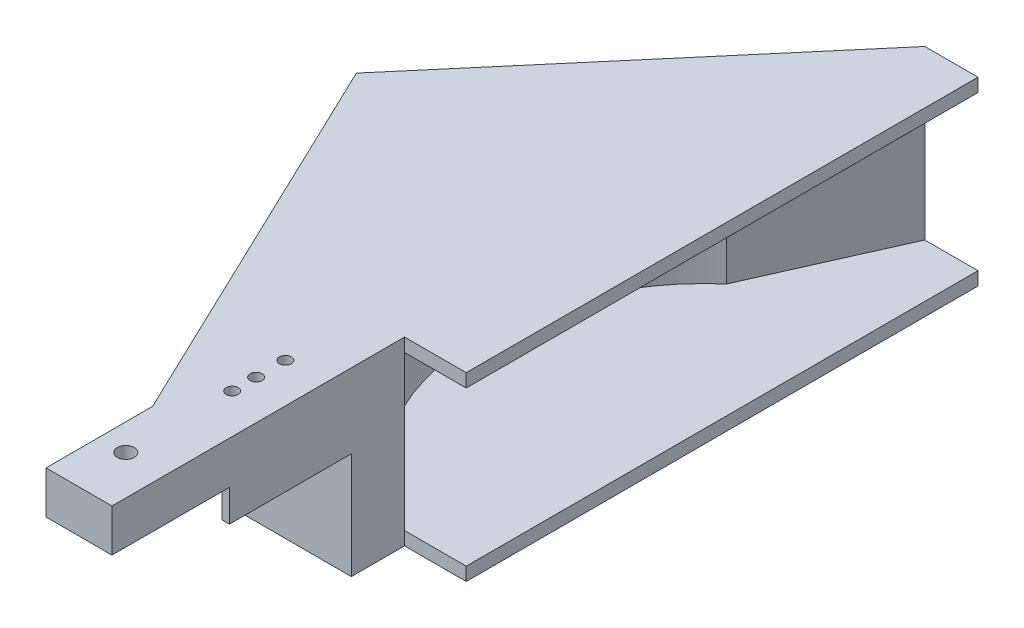
ISO-10303-21;
HEADER;
FILE_DESCRIPTION(('STEP AP214'),'2;1');
FILE_NAME('part.step','',(''),(''),'','','');
FILE_SCHEMA(('AUTOMOTIVE_DESIGN { 1 0 10303 214 1 1 1 1 }'));
ENDSEC;
DATA;
#1=APPLICATION_CONTEXT('core data for automotive mechanical design processes');
#2=APPLICATION_PROTOCOL_DEFINITION('international standard','automotive_design',2000,#1);
#3=PRODUCT_CONTEXT('',#1,'mechanical');
#4=PRODUCT('Part','Part','',(#3));
#5=PRODUCT_RELATED_PRODUCT_CATEGORY('part','',(#4));
#6=PRODUCT_DEFINITION_FORMATION('','',#4);
#7=PRODUCT_DEFINITION_CONTEXT('part definition',#1,'design');
#8=PRODUCT_DEFINITION('design','',#6,#7);
#9=PRODUCT_DEFINITION_SHAPE('','',#8);
#10=(LENGTH_UNIT() NAMED_UNIT(*) SI_UNIT(.MILLI.,.METRE.));
#11=(NAMED_UNIT(*) PLANE_ANGLE_UNIT() SI_UNIT($,.RADIAN.));
#12=(NAMED_UNIT(*) SI_UNIT($,.STERADIAN.) SOLID_ANGLE_UNIT());
#13=UNCERTAINTY_MEASURE_WITH_UNIT(LENGTH_MEASURE(1.E-05),#10,'distance_accuracy_value','');
#14=(GEOMETRIC_REPRESENTATION_CONTEXT(3) GLOBAL_UNCERTAINTY_ASSIGNED_CONTEXT((#13)) GLOBAL_UNIT_ASSIGNED_CONTEXT((#10,
#11,#12)) REPRESENTATION_CONTEXT('',''));
#15=CARTESIAN_POINT('',(0.,0.,0.));
#16=DIRECTION('',(0.,0.,1.));
#17=DIRECTION('',(1.,0.,0.));
#18=AXIS2_PLACEMENT_3D('',#15,#16,#17);
#19=CARTESIAN_POINT('',(65.6220237420334,14.,0.));
#20=DIRECTION('',(0.,-1.,0.));
#21=DIRECTION('',(0.,0.,-1.));
#22=AXIS2_PLACEMENT_3D('',#19,#20,#21);
#23=CYLINDRICAL_SURFACE('',#22,42.5);
#24=CARTESIAN_POINT('',(65.6220237420334,-17.5,0.));
#25=DIRECTION('',(0.,-1.,0.));
#26=DIRECTION('',(0.,0.,-1.));
#27=AXIS2_PLACEMENT_3D('',#24,#25,#26);
#28=CIRCLE('',#27,42.5);
#29=CARTESIAN_POINT('',(37.6279708810943,-17.5,-31.977851779301));
#30=VERTEX_POINT('',#29);
#31=CARTESIAN_POINT('',(47.5,-17.5,38.4427139454693));
#32=VERTEX_POINT('',#31);
#33=EDGE_CURVE('E207',#30,#32,#28,.F.);
#34=ORIENTED_EDGE('',*,*,#33,.F.);
#35=DIRECTION('',(0.,-1.,0.));
#36=VECTOR('',#35,1.);
#37=CARTESIAN_POINT('',(37.6279708810943,14.,-31.977851779301));
#38=LINE('',#37,#36);
#39=CARTESIAN_POINT('',(37.6279708810943,11.5,-31.977851779301));
#40=VERTEX_POINT('',#39);
#41=EDGE_CURVE('E368',#40,#30,#38,.T.);
#42=ORIENTED_EDGE('',*,*,#41,.F.);
#43=CARTESIAN_POINT('',(65.6220237420334,11.5,0.));
#44=DIRECTION('',(0.,1.,0.));
#45=DIRECTION('',(0.,0.,1.));
#46=AXIS2_PLACEMENT_3D('',#43,#44,#45);
#47=CIRCLE('',#46,42.5);
#48=CARTESIAN_POINT('',(47.5,11.5,38.4427139454693));
#49=VERTEX_POINT('',#48);
#50=EDGE_CURVE('E249',#49,#40,#47,.F.);
#51=ORIENTED_EDGE('',*,*,#50,.F.);
#52=DIRECTION('',(0.,-1.,0.));
#53=VECTOR('',#52,1.);
#54=CARTESIAN_POINT('',(47.5,14.,38.4427139454693));
#55=LINE('',#54,#53);
#56=EDGE_CURVE('E371',#49,#32,#55,.T.);
#57=ORIENTED_EDGE('',*,*,#56,.T.);
#58=EDGE_LOOP('',(#34,#42,#51,#57));
#59=FACE_BOUND('',#58,.T.);
#60=ADVANCED_FACE('F43',(#59),#23,.F.);
#61=CARTESIAN_POINT('',(49.0919336266223,14.,-57.7552160313204));
#62=DIRECTION('',(-0.913714746404058,0.,-0.406356201138567));
#63=DIRECTION('',(-0.406356201138567,0.,0.913714746404058));
#64=AXIS2_PLACEMENT_3D('',#61,#62,#63);
#65=PLANE('',#64);
#66=DIRECTION('',(-0.406356201138567,0.,0.913714746404058));
#67=VECTOR('',#66,1.);
#68=CARTESIAN_POINT('',(49.0919336266223,-17.5,-57.7552160313204));
#69=LINE('',#68,#67);
#70=CARTESIAN_POINT('',(49.0919336266223,-17.5,-57.7552160313204));
#71=VERTEX_POINT('',#70);
#72=EDGE_CURVE('E225',#71,#30,#69,.T.);
#73=ORIENTED_EDGE('',*,*,#72,.F.);
#74=DIRECTION('',(0.,-1.,0.));
#75=VECTOR('',#74,1.);
#76=CARTESIAN_POINT('',(49.0919336266223,14.,-57.7552160313204));
#77=LINE('',#76,#75);
#78=CARTESIAN_POINT('',(49.0919336266223,11.5,-57.7552160313204));
#79=VERTEX_POINT('',#78);
#80=EDGE_CURVE('E364',#79,#71,#77,.T.);
#81=ORIENTED_EDGE('',*,*,#80,.F.);
#82=DIRECTION('',(0.406356201138567,0.,-0.913714746404058));
#83=VECTOR('',#82,1.);
#84=CARTESIAN_POINT('',(49.0919336266223,11.5,-57.7552160313204));
#85=LINE('',#84,#83);
#86=EDGE_CURVE('E246',#40,#79,#85,.T.);
#87=ORIENTED_EDGE('',*,*,#86,.F.);
#88=ORIENTED_EDGE('',*,*,#41,.T.);
#89=EDGE_LOOP('',(#73,#81,#87,#88));
#90=FACE_BOUND('',#89,.T.);
#91=ADVANCED_FACE('F445',(#90),#65,.F.);
#92=CARTESIAN_POINT('',(65.6220237420334,0.,0.));
#93=DIRECTION('',(0.,1.,0.));
#94=DIRECTION('',(0.,0.,1.));
#95=AXIS2_PLACEMENT_3D('',#92,#93,#94);
#96=PLANE('',#95);
#97=DIRECTION('',(-1.,0.,0.));
#98=VECTOR('',#97,1.);
#99=CARTESIAN_POINT('',(47.5,0.,48.4427139454693));
#100=LINE('',#99,#98);
#101=CARTESIAN_POINT('',(47.5,0.,48.4427139454692));
#102=VERTEX_POINT('',#101);
#103=CARTESIAN_POINT('',(23.1583238465963,0.,48.4427139454692));
#104=VERTEX_POINT('',#103);
#105=EDGE_CURVE('E66',#102,#104,#100,.T.);
#106=ORIENTED_EDGE('',*,*,#105,.F.);
#107=DIRECTION('',(0.,0.,-1.));
#108=VECTOR('',#107,1.);
#109=CARTESIAN_POINT('',(47.5,0.,78.4427139454693));
#110=LINE('',#109,#108);
#111=CARTESIAN_POINT('',(47.5,0.,71.3827051827319));
#112=VERTEX_POINT('',#111);
#113=EDGE_CURVE('E338',#112,#102,#110,.T.);
#114=ORIENTED_EDGE('',*,*,#113,.F.);
#115=DIRECTION('',(-1.,0.,0.));
#116=VECTOR('',#115,1.);
#117=CARTESIAN_POINT('',(32.1709783052936,0.,71.3827051827319));
#118=LINE('',#117,#116);
#119=CARTESIAN_POINT('',(46.1350961199202,0.,71.3827051827319));
#120=VERTEX_POINT('',#119);
#121=EDGE_CURVE('E274',#112,#120,#118,.T.);
#122=ORIENTED_EDGE('',*,*,#121,.T.);
#123=DIRECTION('',(0.,0.,1.));
#124=VECTOR('',#123,1.);
#125=CARTESIAN_POINT('',(46.1350961199202,0.,88.0289774574965));
#126=LINE('',#125,#124);
#127=CARTESIAN_POINT('',(46.1350961199202,0.,70.0289774574952));
#128=VERTEX_POINT('',#127);
#129=EDGE_CURVE('E310',#128,#120,#126,.T.);
#130=ORIENTED_EDGE('',*,*,#129,.F.);
#131=DIRECTION('',(0.0772248727797807,0.,0.997013700519781));
#132=VECTOR('',#131,1.);
#133=CARTESIAN_POINT('',(46.1350961199202,0.,70.0289774574952));
#134=LINE('',#133,#132);
#135=CARTESIAN_POINT('',(44.8209111973895,0.,53.0621593117926));
#136=VERTEX_POINT('',#135);
#137=EDGE_CURVE('E320',#136,#128,#134,.T.);
#138=ORIENTED_EDGE('',*,*,#137,.F.);
#139=CARTESIAN_POINT('',(40.0850961199206,0.,53.4289774574965));
#140=DIRECTION('',(0.,-1.,0.));
#141=DIRECTION('',(0.,0.,1.));
#142=AXIS2_PLACEMENT_3D('',#139,#140,#141);
#143=CIRCLE('',#142,4.75);
#144=CARTESIAN_POINT('',(35.3456634300069,0.,53.1123107908298));
#145=VERTEX_POINT('',#144);
#146=EDGE_CURVE('E305',#145,#136,#143,.T.);
#147=ORIENTED_EDGE('',*,*,#146,.F.);
#148=DIRECTION('',(-0.0666666666666827,0.,0.997775303139717));
#149=VECTOR('',#148,1.);
#150=CARTESIAN_POINT('',(39.013168498046,0.,-1.77787892459443));
#151=LINE('',#150,#149);
#152=CARTESIAN_POINT('',(34.1249213561542,0.,71.3827051827318));
#153=VERTEX_POINT('',#152);
#154=EDGE_CURVE('E374',#145,#153,#151,.T.);
#155=ORIENTED_EDGE('',*,*,#154,.T.);
#156=DIRECTION('',(0.431304970230721,0.,0.902206197415135));
#157=VECTOR('',#156,1.);
#158=CARTESIAN_POINT('',(0.,0.,0.));
#159=LINE('',#158,#157);
#160=EDGE_CURVE('E343',#104,#153,#159,.T.);
#161=ORIENTED_EDGE('',*,*,#160,.F.);
#162=EDGE_LOOP('',(#106,#114,#122,#130,#138,#147,#155,#161));
#163=FACE_BOUND('',#162,.T.);
#164=ADVANCED_FACE('F420',(#163),#96,.F.);
#165=CARTESIAN_POINT('',(46.1350961199202,6.,88.0289774574965));
#166=DIRECTION('',(1.,0.,0.));
#167=DIRECTION('',(0.,0.,-1.));
#168=AXIS2_PLACEMENT_3D('',#165,#166,#167);
#169=PLANE('',#168);
#170=DIRECTION('',(0.,-1.,0.));
#171=VECTOR('',#170,1.);
#172=CARTESIAN_POINT('',(46.1350961199202,6.,71.3827051827319));
#173=LINE('',#172,#171);
#174=CARTESIAN_POINT('',(46.1350961199202,6.,71.3827051827319));
#175=VERTEX_POINT('',#174);
#176=EDGE_CURVE('E11',#175,#120,#173,.T.);
#177=ORIENTED_EDGE('',*,*,#176,.F.);
#178=DIRECTION('',(0.,0.,1.));
#179=VECTOR('',#178,1.);
#180=CARTESIAN_POINT('',(46.1350961199202,6.,88.0289774574965));
#181=LINE('',#180,#179);
#182=CARTESIAN_POINT('',(46.1350961199202,6.,70.0289774574952));
#183=VERTEX_POINT('',#182);
#184=EDGE_CURVE('E313',#183,#175,#181,.T.);
#185=ORIENTED_EDGE('',*,*,#184,.F.);
#186=DIRECTION('',(0.,-1.,0.));
#187=VECTOR('',#186,1.);
#188=CARTESIAN_POINT('',(46.1350961199202,6.,70.0289774574952));
#189=LINE('',#188,#187);
#190=EDGE_CURVE('E329',#183,#128,#189,.T.);
#191=ORIENTED_EDGE('',*,*,#190,.T.);
#192=ORIENTED_EDGE('',*,*,#129,.T.);
#193=EDGE_LOOP('',(#177,#185,#191,#192));
#194=FACE_BOUND('',#193,.T.);
#195=ADVANCED_FACE('F416',(#194),#169,.F.);
#196=CARTESIAN_POINT('',(47.5,14.,78.4427139454693));
#197=DIRECTION('',(-1.,0.,0.));
#198=DIRECTION('',(0.,0.,1.));
#199=AXIS2_PLACEMENT_3D('',#196,#197,#198);
#200=PLANE('',#199);
#201=DIRECTION('',(0.,-1.,0.));
#202=VECTOR('',#201,1.);
#203=CARTESIAN_POINT('',(47.5,14.,93.4427139454693));
#204=LINE('',#203,#202);
#205=CARTESIAN_POINT('',(47.5,14.,93.4427139454693));
#206=VERTEX_POINT('',#205);
#207=CARTESIAN_POINT('',(47.5,6.,93.4427139454693));
#208=VERTEX_POINT('',#207);
#209=EDGE_CURVE('E351',#206,#208,#204,.T.);
#210=ORIENTED_EDGE('',*,*,#209,.T.);
#211=DIRECTION('',(0.,0.,-1.));
#212=VECTOR('',#211,1.);
#213=CARTESIAN_POINT('',(47.5,6.,78.4427139454693));
#214=LINE('',#213,#212);
#215=CARTESIAN_POINT('',(47.5,6.,71.3827051827319));
#216=VERTEX_POINT('',#215);
#217=EDGE_CURVE('E282',#208,#216,#214,.T.);
#218=ORIENTED_EDGE('',*,*,#217,.T.);
#219=DIRECTION('',(0.,1.,0.));
#220=VECTOR('',#219,1.);
#221=CARTESIAN_POINT('',(47.5,14.,71.3827051827319));
#222=LINE('',#221,#220);
#223=EDGE_CURVE('E285',#112,#216,#222,.T.);
#224=ORIENTED_EDGE('',*,*,#223,.F.);
#225=ORIENTED_EDGE('',*,*,#113,.T.);
#226=DIRECTION('',(0.,1.,0.));
#227=VECTOR('',#226,1.);
#228=CARTESIAN_POINT('',(47.5,-20.,48.4427139454693));
#229=LINE('',#228,#227);
#230=CARTESIAN_POINT('',(47.5,-20.,48.4427139454693));
#231=VERTEX_POINT('',#230);
#232=EDGE_CURVE('E264',#231,#102,#229,.T.);
#233=ORIENTED_EDGE('',*,*,#232,.F.);
#234=DIRECTION('',(0.,0.,1.));
#235=VECTOR('',#234,1.);
#236=CARTESIAN_POINT('',(47.5,-20.,38.4427139454693));
#237=LINE('',#236,#235);
#238=CARTESIAN_POINT('',(47.5,-20.,38.4427139454693));
#239=VERTEX_POINT('',#238);
#240=EDGE_CURVE('E251',#239,#231,#237,.T.);
#241=ORIENTED_EDGE('',*,*,#240,.F.);
#242=DIRECTION('',(0.,1.,0.));
#243=VECTOR('',#242,1.);
#244=CARTESIAN_POINT('',(47.5,14.,38.4427139454693));
#245=LINE('',#244,#243);
#246=EDGE_CURVE('E221',#239,#32,#245,.T.);
#247=ORIENTED_EDGE('',*,*,#246,.T.);
#248=ORIENTED_EDGE('',*,*,#56,.F.);
#249=CARTESIAN_POINT('',(47.5,14.,38.4427139454693));
#250=VERTEX_POINT('',#249);
#251=EDGE_CURVE('E372',#250,#49,#55,.T.);
#252=ORIENTED_EDGE('',*,*,#251,.F.);
#253=DIRECTION('',(0.,0.,-1.));
#254=VECTOR('',#253,1.);
#255=CARTESIAN_POINT('',(47.5,14.,78.4427139454693));
#256=LINE('',#255,#254);
#257=EDGE_CURVE('E339',#206,#250,#256,.T.);
#258=ORIENTED_EDGE('',*,*,#257,.F.);
#259=EDGE_LOOP('',(#210,#218,#224,#225,#233,#241,#247,#248,#252,#258));
#260=FACE_BOUND('',#259,.T.);
#261=ADVANCED_FACE('F45',(#260),#200,.F.);
#262=CARTESIAN_POINT('',(49.0919336266223,14.,-57.7552160313204));
#263=DIRECTION('',(0.761939317759459,0.,0.64764842009554));
#264=DIRECTION('',(0.64764842009554,0.,-0.761939317759459));
#265=AXIS2_PLACEMENT_3D('',#262,#263,#264);
#266=PLANE('',#265);
#267=DIRECTION('',(0.,-1.,0.));
#268=VECTOR('',#267,1.);
#269=CARTESIAN_POINT('',(49.0919336266223,-17.5,-57.7552160313204));
#270=LINE('',#269,#268);
#271=CARTESIAN_POINT('',(49.0919336266223,-20.,-57.7552160313204));
#272=VERTEX_POINT('',#271);
#273=EDGE_CURVE('E197',#71,#272,#270,.T.);
#274=ORIENTED_EDGE('',*,*,#273,.T.);
#275=DIRECTION('',(0.64764842009554,0.,-0.761939317759459));
#276=VECTOR('',#275,1.);
#277=CARTESIAN_POINT('',(49.0919336266223,-20.,-57.7552160313204));
#278=LINE('',#277,#276);
#279=CARTESIAN_POINT('',(0.,-20.,0.));
#280=VERTEX_POINT('',#279);
#281=EDGE_CURVE('E258',#280,#272,#278,.T.);
#282=ORIENTED_EDGE('',*,*,#281,.F.);
#283=DIRECTION('',(0.,-1.,0.));
#284=VECTOR('',#283,1.);
#285=CARTESIAN_POINT('',(0.,14.,0.));
#286=LINE('',#285,#284);
#287=CARTESIAN_POINT('',(0.,14.,0.));
#288=VERTEX_POINT('',#287);
#289=EDGE_CURVE('E362',#288,#280,#286,.T.);
#290=ORIENTED_EDGE('',*,*,#289,.F.);
#291=DIRECTION('',(-0.64764842009554,0.,0.761939317759459));
#292=VECTOR('',#291,1.);
#293=CARTESIAN_POINT('',(49.0919336266223,14.,-57.7552160313204));
#294=LINE('',#293,#292);
#295=CARTESIAN_POINT('',(49.0919336266223,14.,-57.7552160313204));
#296=VERTEX_POINT('',#295);
#297=EDGE_CURVE('E342',#296,#288,#294,.T.);
#298=ORIENTED_EDGE('',*,*,#297,.F.);
#299=EDGE_CURVE('E365',#296,#79,#77,.T.);
#300=ORIENTED_EDGE('',*,*,#299,.T.);
#301=ORIENTED_EDGE('',*,*,#80,.T.);
#302=EDGE_LOOP('',(#274,#282,#290,#298,#300,#301));
#303=FACE_BOUND('',#302,.T.);
#304=ADVANCED_FACE('F448',(#303),#266,.F.);
#305=CARTESIAN_POINT('',(0.,14.,0.));
#306=DIRECTION('',(0.902206197415135,0.,-0.431304970230721));
#307=DIRECTION('',(-0.431304970230721,0.,-0.902206197415135));
#308=AXIS2_PLACEMENT_3D('',#305,#306,#307);
#309=PLANE('',#308);
#310=ORIENTED_EDGE('',*,*,#289,.T.);
#311=DIRECTION('',(-0.43130497023072,0.,-0.902206197415135));
#312=VECTOR('',#311,1.);
#313=CARTESIAN_POINT('',(23.1583238465963,-20.,48.4427139454692));
#314=LINE('',#313,#312);
#315=CARTESIAN_POINT('',(23.1583238465963,-20.,48.4427139454692));
#316=VERTEX_POINT('',#315);
#317=EDGE_CURVE('E255',#316,#280,#314,.T.);
#318=ORIENTED_EDGE('',*,*,#317,.F.);
#319=DIRECTION('',(0.,1.,0.));
#320=VECTOR('',#319,1.);
#321=CARTESIAN_POINT('',(23.1583238465963,-20.,48.4427139454692));
#322=LINE('',#321,#320);
#323=EDGE_CURVE('E260',#316,#104,#322,.T.);
#324=ORIENTED_EDGE('',*,*,#323,.T.);
#325=ORIENTED_EDGE('',*,*,#160,.T.);
#326=DIRECTION('',(0.,1.,0.));
#327=VECTOR('',#326,1.);
#328=CARTESIAN_POINT('',(34.1249213561542,14.,71.3827051827318));
#329=LINE('',#328,#327);
#330=CARTESIAN_POINT('',(34.1249213561543,6.,71.3827051827319));
#331=VERTEX_POINT('',#330);
#332=EDGE_CURVE('E328',#153,#331,#329,.T.);
#333=ORIENTED_EDGE('',*,*,#332,.T.);
#334=DIRECTION('',(0.431304970230721,0.,0.902206197415135));
#335=VECTOR('',#334,1.);
#336=CARTESIAN_POINT('',(0.,6.,0.));
#337=LINE('',#336,#335);
#338=CARTESIAN_POINT('',(35.1,6.,73.4223802529592));
#339=VERTEX_POINT('',#338);
#340=EDGE_CURVE('E335',#331,#339,#337,.T.);
#341=ORIENTED_EDGE('',*,*,#340,.T.);
#342=DIRECTION('',(0.,-1.,0.));
#343=VECTOR('',#342,1.);
#344=CARTESIAN_POINT('',(35.1,14.,73.4223802529592));
#345=LINE('',#344,#343);
#346=CARTESIAN_POINT('',(35.1,14.,73.4223802529592));
#347=VERTEX_POINT('',#346);
#348=EDGE_CURVE('E359',#347,#339,#345,.T.);
#349=ORIENTED_EDGE('',*,*,#348,.F.);
#350=DIRECTION('',(0.431304970230721,0.,0.902206197415135));
#351=VECTOR('',#350,1.);
#352=CARTESIAN_POINT('',(0.,14.,0.));
#353=LINE('',#352,#351);
#354=EDGE_CURVE('E345',#288,#347,#353,.T.);
#355=ORIENTED_EDGE('',*,*,#354,.F.);
#356=EDGE_LOOP('',(#310,#318,#324,#325,#333,#341,#349,#355));
#357=FACE_BOUND('',#356,.T.);
#358=ADVANCED_FACE('F398',(#357),#309,.F.);
#359=CARTESIAN_POINT('',(35.1,14.,73.4223802529592));
#360=DIRECTION('',(1.,0.,0.));
#361=DIRECTION('',(0.,0.,-1.));
#362=AXIS2_PLACEMENT_3D('',#359,#360,#361);
#363=PLANE('',#362);
#364=DIRECTION('',(0.,0.,1.));
#365=VECTOR('',#364,1.);
#366=CARTESIAN_POINT('',(35.1,6.,73.4223802529592));
#367=LINE('',#366,#365);
#368=CARTESIAN_POINT('',(35.1,6.,93.4427139454693));
#369=VERTEX_POINT('',#368);
#370=EDGE_CURVE('E51',#339,#369,#367,.T.);
#371=ORIENTED_EDGE('',*,*,#370,.T.);
#372=DIRECTION('',(0.,-1.,0.));
#373=VECTOR('',#372,1.);
#374=CARTESIAN_POINT('',(35.1,14.,93.4427139454693));
#375=LINE('',#374,#373);
#376=CARTESIAN_POINT('',(35.1,14.,93.4427139454693));
#377=VERTEX_POINT('',#376);
#378=EDGE_CURVE('E356',#377,#369,#375,.T.);
#379=ORIENTED_EDGE('',*,*,#378,.F.);
#380=DIRECTION('',(0.,0.,1.));
#381=VECTOR('',#380,1.);
#382=CARTESIAN_POINT('',(35.1,14.,73.4223802529592));
#383=LINE('',#382,#381);
#384=EDGE_CURVE('E347',#347,#377,#383,.T.);
#385=ORIENTED_EDGE('',*,*,#384,.F.);
#386=ORIENTED_EDGE('',*,*,#348,.T.);
#387=EDGE_LOOP('',(#371,#379,#385,#386));
#388=FACE_BOUND('',#387,.T.);
#389=ADVANCED_FACE('F379',(#388),#363,.F.);
#390=CARTESIAN_POINT('',(37.5,14.,93.4427139454693));
#391=DIRECTION('',(0.,0.,-1.));
#392=DIRECTION('',(-1.,0.,0.));
#393=AXIS2_PLACEMENT_3D('',#390,#391,#392);
#394=PLANE('',#393);
#395=ORIENTED_EDGE('',*,*,#378,.T.);
#396=DIRECTION('',(1.,0.,0.));
#397=VECTOR('',#396,1.);
#398=CARTESIAN_POINT('',(37.5,6.,93.4427139454693));
#399=LINE('',#398,#397);
#400=EDGE_CURVE('E277',#369,#208,#399,.T.);
#401=ORIENTED_EDGE('',*,*,#400,.T.);
#402=ORIENTED_EDGE('',*,*,#209,.F.);
#403=DIRECTION('',(1.,0.,0.));
#404=VECTOR('',#403,1.);
#405=CARTESIAN_POINT('',(35.1,14.,93.4427139454693));
#406=LINE('',#405,#404);
#407=EDGE_CURVE('E349',#377,#206,#406,.T.);
#408=ORIENTED_EDGE('',*,*,#407,.F.);
#409=EDGE_LOOP('',(#395,#401,#402,#408));
#410=FACE_BOUND('',#409,.T.);
#411=ADVANCED_FACE('F388',(#410),#394,.F.);
#412=CARTESIAN_POINT('',(65.6220237420334,14.,0.));
#413=DIRECTION('',(0.,1.,0.));
#414=DIRECTION('',(0.,0.,1.));
#415=AXIS2_PLACEMENT_3D('',#412,#413,#414);
#416=PLANE('',#415);
#417=ORIENTED_EDGE('',*,*,#257,.T.);
#418=DIRECTION('',(1.,0.,0.));
#419=VECTOR('',#418,1.);
#420=CARTESIAN_POINT('',(23.1220237420334,14.,38.4427139454693));
#421=LINE('',#420,#419);
#422=CARTESIAN_POINT('',(59.0919336266223,14.,38.4427139454693));
#423=VERTEX_POINT('',#422);
#424=EDGE_CURVE('E232',#250,#423,#421,.T.);
#425=ORIENTED_EDGE('',*,*,#424,.T.);
#426=DIRECTION('',(0.,0.,-1.));
#427=VECTOR('',#426,1.);
#428=CARTESIAN_POINT('',(59.0919336266223,14.,-57.7552160313204));
#429=LINE('',#428,#427);
#430=CARTESIAN_POINT('',(59.0919336266223,14.,-57.7552160313204));
#431=VERTEX_POINT('',#430);
#432=EDGE_CURVE('E228',#423,#431,#429,.T.);
#433=ORIENTED_EDGE('',*,*,#432,.T.);
#434=DIRECTION('',(-1.,0.,0.));
#435=VECTOR('',#434,1.);
#436=CARTESIAN_POINT('',(49.0919336266223,14.,-57.7552160313204));
#437=LINE('',#436,#435);
#438=EDGE_CURVE('E239',#431,#296,#437,.T.);
#439=ORIENTED_EDGE('',*,*,#438,.T.);
#440=ORIENTED_EDGE('',*,*,#297,.T.);
#441=ORIENTED_EDGE('',*,*,#354,.T.);
#442=ORIENTED_EDGE('',*,*,#384,.T.);
#443=ORIENTED_EDGE('',*,*,#407,.T.);
#444=EDGE_LOOP('',(#417,#425,#433,#439,#440,#441,#442,#443));
#445=FACE_BOUND('',#444,.T.);
#446=CARTESIAN_POINT('',(40.0850961199206,14.,83.4289774574965));
#447=DIRECTION('',(0.,1.,0.));
#448=DIRECTION('',(0.,0.,1.));
#449=AXIS2_PLACEMENT_3D('',#446,#447,#448);
#450=CIRCLE('',#449,1.6);
#451=CARTESIAN_POINT('',(40.0850961199206,14.,85.0289774574965));
#452=VERTEX_POINT('',#451);
#453=EDGE_CURVE('E267',#452,#452,#450,.T.);
#454=ORIENTED_EDGE('',*,*,#453,.F.);
#455=EDGE_LOOP('',(#454));
#456=FACE_BOUND('',#455,.T.);
#457=CARTESIAN_POINT('',(40.0850961199206,14.,63.4289774574965));
#458=DIRECTION('',(0.,1.,0.));
#459=DIRECTION('',(0.,0.,1.));
#460=AXIS2_PLACEMENT_3D('',#457,#458,#459);
#461=CIRCLE('',#460,1.125);
#462=CARTESIAN_POINT('',(40.0850961199206,14.,64.5539774574965));
#463=VERTEX_POINT('',#462);
#464=EDGE_CURVE('E302',#463,#463,#461,.T.);
#465=ORIENTED_EDGE('',*,*,#464,.F.);
#466=EDGE_LOOP('',(#465));
#467=FACE_BOUND('',#466,.T.);
#468=CARTESIAN_POINT('',(40.0850961199206,14.,58.9289774574965));
#469=DIRECTION('',(0.,1.,0.));
#470=DIRECTION('',(0.,0.,1.));
#471=AXIS2_PLACEMENT_3D('',#468,#469,#470);
#472=CIRCLE('',#471,1.125);
#473=CARTESIAN_POINT('',(40.0850961199206,14.,60.0539774574965));
#474=VERTEX_POINT('',#473);
#475=EDGE_CURVE('E299',#474,#474,#472,.T.);
#476=ORIENTED_EDGE('',*,*,#475,.F.);
#477=EDGE_LOOP('',(#476));
#478=FACE_BOUND('',#477,.T.);
#479=CARTESIAN_POINT('',(40.0850961199206,14.,53.4289774574965));
#480=DIRECTION('',(0.,1.,0.));
#481=DIRECTION('',(0.,0.,1.));
#482=AXIS2_PLACEMENT_3D('',#479,#480,#481);
#483=CIRCLE('',#482,1.125);
#484=CARTESIAN_POINT('',(40.0850961199206,14.,54.5539774574965));
#485=VERTEX_POINT('',#484);
#486=EDGE_CURVE('E291',#485,#485,#483,.T.);
#487=ORIENTED_EDGE('',*,*,#486,.F.);
#488=EDGE_LOOP('',(#487));
#489=FACE_BOUND('',#488,.T.);
#490=ADVANCED_FACE('F391',(#445,#456,#467,#478,#489),#416,.T.);
#491=CARTESIAN_POINT('',(40.0850961199206,6.,53.4289774574965));
#492=DIRECTION('',(0.,1.,0.));
#493=DIRECTION('',(0.,0.,1.));
#494=AXIS2_PLACEMENT_3D('',#491,#492,#493);
#495=PLANE('',#494);
#496=CARTESIAN_POINT('',(40.0850961199206,6.,83.4289774574965));
#497=DIRECTION('',(0.,1.,0.));
#498=DIRECTION('',(0.,0.,1.));
#499=AXIS2_PLACEMENT_3D('',#496,#497,#498);
#500=CIRCLE('',#499,1.6);
#501=CARTESIAN_POINT('',(40.0850961199206,6.,85.0289774574965));
#502=VERTEX_POINT('',#501);
#503=EDGE_CURVE('E270',#502,#502,#500,.F.);
#504=ORIENTED_EDGE('',*,*,#503,.F.);
#505=EDGE_LOOP('',(#504));
#506=FACE_BOUND('',#505,.T.);
#507=ORIENTED_EDGE('',*,*,#400,.F.);
#508=ORIENTED_EDGE('',*,*,#370,.F.);
#509=ORIENTED_EDGE('',*,*,#340,.F.);
#510=DIRECTION('',(0.0666666666666827,0.,-0.997775303139717));
#511=VECTOR('',#510,1.);
#512=CARTESIAN_POINT('',(35.3456634300069,6.,53.1123107908298));
#513=LINE('',#512,#511);
#514=CARTESIAN_POINT('',(35.3456634300069,6.,53.1123107908298));
#515=VERTEX_POINT('',#514);
#516=EDGE_CURVE('E316',#331,#515,#513,.T.);
#517=ORIENTED_EDGE('',*,*,#516,.T.);
#518=CARTESIAN_POINT('',(40.0850961199206,6.,53.4289774574965));
#519=DIRECTION('',(0.,-1.,0.));
#520=DIRECTION('',(0.,0.,1.));
#521=AXIS2_PLACEMENT_3D('',#518,#519,#520);
#522=CIRCLE('',#521,4.75);
#523=CARTESIAN_POINT('',(44.8209111973895,6.,53.0621593117926));
#524=VERTEX_POINT('',#523);
#525=EDGE_CURVE('E306',#515,#524,#522,.T.);
#526=ORIENTED_EDGE('',*,*,#525,.T.);
#527=DIRECTION('',(0.0772248727797807,0.,0.997013700519781));
#528=VECTOR('',#527,1.);
#529=CARTESIAN_POINT('',(46.1350961199202,6.,70.0289774574952));
#530=LINE('',#529,#528);
#531=EDGE_CURVE('E309',#524,#183,#530,.T.);
#532=ORIENTED_EDGE('',*,*,#531,.T.);
#533=ORIENTED_EDGE('',*,*,#184,.T.);
#534=DIRECTION('',(1.,0.,0.));
#535=VECTOR('',#534,1.);
#536=CARTESIAN_POINT('',(32.1709783052936,6.,71.3827051827319));
#537=LINE('',#536,#535);
#538=EDGE_CURVE('E273',#175,#216,#537,.T.);
#539=ORIENTED_EDGE('',*,*,#538,.T.);
#540=ORIENTED_EDGE('',*,*,#217,.F.);
#541=EDGE_LOOP('',(#507,#508,#509,#517,#526,#532,#533,#539,#540));
#542=FACE_BOUND('',#541,.T.);
#543=CARTESIAN_POINT('',(40.0850961199206,6.,53.4289774574965));
#544=DIRECTION('',(0.,-1.,0.));
#545=DIRECTION('',(0.,0.,-1.));
#546=AXIS2_PLACEMENT_3D('',#543,#544,#545);
#547=CIRCLE('',#546,1.125);
#548=CARTESIAN_POINT('',(40.0850961199206,6.,52.3039774574965));
#549=VERTEX_POINT('',#548);
#550=EDGE_CURVE('E287',#549,#549,#547,.T.);
#551=ORIENTED_EDGE('',*,*,#550,.F.);
#552=EDGE_LOOP('',(#551));
#553=FACE_BOUND('',#552,.T.);
#554=CARTESIAN_POINT('',(40.0850961199206,6.,58.9289774574965));
#555=DIRECTION('',(0.,-1.,0.));
#556=DIRECTION('',(0.,0.,-1.));
#557=AXIS2_PLACEMENT_3D('',#554,#555,#556);
#558=CIRCLE('',#557,1.125);
#559=CARTESIAN_POINT('',(40.0850961199206,6.,57.8039774574965));
#560=VERTEX_POINT('',#559);
#561=EDGE_CURVE('E292',#560,#560,#558,.T.);
#562=ORIENTED_EDGE('',*,*,#561,.F.);
#563=EDGE_LOOP('',(#562));
#564=FACE_BOUND('',#563,.T.);
#565=CARTESIAN_POINT('',(40.0850961199206,6.,63.4289774574965));
#566=DIRECTION('',(0.,-1.,0.));
#567=DIRECTION('',(0.,0.,-1.));
#568=AXIS2_PLACEMENT_3D('',#565,#566,#567);
#569=CIRCLE('',#568,1.125);
#570=CARTESIAN_POINT('',(40.0850961199206,6.,62.3039774574965));
#571=VERTEX_POINT('',#570);
#572=EDGE_CURVE('E288',#571,#571,#569,.T.);
#573=ORIENTED_EDGE('',*,*,#572,.F.);
#574=EDGE_LOOP('',(#573));
#575=FACE_BOUND('',#574,.T.);
#576=ADVANCED_FACE('F384',(#506,#542,#553,#564,#575),#495,.F.);
#577=CARTESIAN_POINT('',(35.3456634300069,6.,53.1123107908298));
#578=DIRECTION('',(-0.997775303139717,0.,-0.0666666666666827));
#579=DIRECTION('',(-0.0666666666666827,0.,0.997775303139717));
#580=AXIS2_PLACEMENT_3D('',#577,#578,#579);
#581=PLANE('',#580);
#582=ORIENTED_EDGE('',*,*,#154,.F.);
#583=DIRECTION('',(0.,-1.,0.));
#584=VECTOR('',#583,1.);
#585=CARTESIAN_POINT('',(35.3456634300069,6.,53.1123107908298));
#586=LINE('',#585,#584);
#587=EDGE_CURVE('E325',#515,#145,#586,.T.);
#588=ORIENTED_EDGE('',*,*,#587,.F.);
#589=ORIENTED_EDGE('',*,*,#516,.F.);
#590=ORIENTED_EDGE('',*,*,#332,.F.);
#591=EDGE_LOOP('',(#582,#588,#589,#590));
#592=FACE_BOUND('',#591,.T.);
#593=ADVANCED_FACE('F403',(#592),#581,.F.);
#594=CARTESIAN_POINT('',(40.0850961199206,6.,53.4289774574965));
#595=DIRECTION('',(0.,-1.,0.));
#596=DIRECTION('',(0.,0.,-1.));
#597=AXIS2_PLACEMENT_3D('',#594,#595,#596);
#598=CYLINDRICAL_SURFACE('',#597,4.75);
#599=ORIENTED_EDGE('',*,*,#146,.T.);
#600=DIRECTION('',(0.,-1.,0.));
#601=VECTOR('',#600,1.);
#602=CARTESIAN_POINT('',(44.8209111973895,6.,53.0621593117926));
#603=LINE('',#602,#601);
#604=EDGE_CURVE('E318',#524,#136,#603,.T.);
#605=ORIENTED_EDGE('',*,*,#604,.F.);
#606=ORIENTED_EDGE('',*,*,#525,.F.);
#607=ORIENTED_EDGE('',*,*,#587,.T.);
#608=EDGE_LOOP('',(#599,#605,#606,#607));
#609=FACE_BOUND('',#608,.T.);
#610=ADVANCED_FACE('F407',(#609),#598,.F.);
#611=CARTESIAN_POINT('',(46.1350961199202,6.,70.0289774574952));
#612=DIRECTION('',(0.99701370051978,0.,-0.0772248727797807));
#613=DIRECTION('',(-0.0772248727797807,0.,-0.997013700519781));
#614=AXIS2_PLACEMENT_3D('',#611,#612,#613);
#615=PLANE('',#614);
#616=ORIENTED_EDGE('',*,*,#137,.T.);
#617=ORIENTED_EDGE('',*,*,#190,.F.);
#618=ORIENTED_EDGE('',*,*,#531,.F.);
#619=ORIENTED_EDGE('',*,*,#604,.T.);
#620=EDGE_LOOP('',(#616,#617,#618,#619));
#621=FACE_BOUND('',#620,.T.);
#622=ADVANCED_FACE('F411',(#621),#615,.F.);
#623=CARTESIAN_POINT('',(40.0850961199206,21.,53.4289774574965));
#624=DIRECTION('',(0.,-1.,0.));
#625=DIRECTION('',(0.,0.,-1.));
#626=AXIS2_PLACEMENT_3D('',#623,#624,#625);
#627=CYLINDRICAL_SURFACE('',#626,1.125);
#628=ORIENTED_EDGE('',*,*,#486,.T.);
#629=EDGE_LOOP('',(#628));
#630=FACE_BOUND('',#629,.T.);
#631=ORIENTED_EDGE('',*,*,#550,.T.);
#632=EDGE_LOOP('',(#631));
#633=FACE_BOUND('',#632,.T.);
#634=ADVANCED_FACE('F488',(#630,#633),#627,.F.);
#635=CARTESIAN_POINT('',(40.0850961199206,21.,58.9289774574965));
#636=DIRECTION('',(0.,-1.,0.));
#637=DIRECTION('',(0.,0.,-1.));
#638=AXIS2_PLACEMENT_3D('',#635,#636,#637);
#639=CYLINDRICAL_SURFACE('',#638,1.125);
#640=ORIENTED_EDGE('',*,*,#475,.T.);
#641=EDGE_LOOP('',(#640));
#642=FACE_BOUND('',#641,.T.);
#643=ORIENTED_EDGE('',*,*,#561,.T.);
#644=EDGE_LOOP('',(#643));
#645=FACE_BOUND('',#644,.T.);
#646=ADVANCED_FACE('F498',(#642,#645),#639,.F.);
#647=CARTESIAN_POINT('',(40.0850961199206,21.,63.4289774574965));
#648=DIRECTION('',(0.,-1.,0.));
#649=DIRECTION('',(0.,0.,-1.));
#650=AXIS2_PLACEMENT_3D('',#647,#648,#649);
#651=CYLINDRICAL_SURFACE('',#650,1.125);
#652=ORIENTED_EDGE('',*,*,#464,.T.);
#653=EDGE_LOOP('',(#652));
#654=FACE_BOUND('',#653,.T.);
#655=ORIENTED_EDGE('',*,*,#572,.T.);
#656=EDGE_LOOP('',(#655));
#657=FACE_BOUND('',#656,.T.);
#658=ADVANCED_FACE('F502',(#654,#657),#651,.F.);
#659=CARTESIAN_POINT('',(32.1709783052936,-47.1327480906307,71.3827051827319));
#660=DIRECTION('',(0.,0.,1.));
#661=DIRECTION('',(1.,0.,0.));
#662=AXIS2_PLACEMENT_3D('',#659,#660,#661);
#663=PLANE('',#662);
#664=ORIENTED_EDGE('',*,*,#223,.T.);
#665=ORIENTED_EDGE('',*,*,#538,.F.);
#666=ORIENTED_EDGE('',*,*,#176,.T.);
#667=ORIENTED_EDGE('',*,*,#121,.F.);
#668=EDGE_LOOP('',(#664,#665,#666,#667));
#669=FACE_BOUND('',#668,.T.);
#670=ADVANCED_FACE('F418',(#669),#663,.T.);
#671=CARTESIAN_POINT('',(40.0850961199206,-0.000999999999999265,83.4289774574965));
#672=DIRECTION('',(0.,1.,0.));
#673=DIRECTION('',(0.,0.,1.));
#674=AXIS2_PLACEMENT_3D('',#671,#672,#673);
#675=CYLINDRICAL_SURFACE('',#674,1.6);
#676=CARTESIAN_POINT('',(40.0850961199206,14.,85.0289774574965));
#677=CARTESIAN_POINT('',(40.0850961199206,13.9166666666667,85.0289774574965));
#678=CARTESIAN_POINT('',(40.0850961199206,13.8333333333333,85.0289774574965));
#679=CARTESIAN_POINT('',(40.0850961199206,13.6666666666667,85.0289774574965));
#680=CARTESIAN_POINT('',(40.0850961199206,13.5833333333333,85.0289774574965));
#681=CARTESIAN_POINT('',(40.0850961199206,13.4166666666667,85.0289774574965));
#682=CARTESIAN_POINT('',(40.0850961199206,13.3333333333333,85.0289774574965));
#683=CARTESIAN_POINT('',(40.0850961199206,13.1666666666667,85.0289774574965));
#684=CARTESIAN_POINT('',(40.0850961199206,13.0833333333333,85.0289774574965));
#685=CARTESIAN_POINT('',(40.0850961199206,12.9166666666667,85.0289774574965));
#686=CARTESIAN_POINT('',(40.0850961199206,12.8333333333333,85.0289774574965));
#687=CARTESIAN_POINT('',(40.0850961199206,12.6666666666667,85.0289774574965));
#688=CARTESIAN_POINT('',(40.0850961199206,12.5833333333333,85.0289774574965));
#689=CARTESIAN_POINT('',(40.0850961199206,12.4166666666667,85.0289774574965));
#690=CARTESIAN_POINT('',(40.0850961199206,12.3333333333333,85.0289774574965));
#691=CARTESIAN_POINT('',(40.0850961199206,12.1666666666667,85.0289774574965));
#692=CARTESIAN_POINT('',(40.0850961199206,12.0833333333333,85.0289774574965));
#693=CARTESIAN_POINT('',(40.0850961199206,11.9166666666667,85.0289774574965));
#694=CARTESIAN_POINT('',(40.0850961199206,11.8333333333333,85.0289774574965));
#695=CARTESIAN_POINT('',(40.0850961199206,11.6666666666667,85.0289774574965));
#696=CARTESIAN_POINT('',(40.0850961199206,11.5833333333333,85.0289774574965));
#697=CARTESIAN_POINT('',(40.0850961199206,11.4166666666667,85.0289774574965));
#698=CARTESIAN_POINT('',(40.0850961199206,11.3333333333333,85.0289774574965));
#699=CARTESIAN_POINT('',(40.0850961199206,11.1666666666667,85.0289774574965));
#700=CARTESIAN_POINT('',(40.0850961199206,11.0833333333333,85.0289774574965));
#701=CARTESIAN_POINT('',(40.0850961199206,10.9166666666667,85.0289774574965));
#702=CARTESIAN_POINT('',(40.0850961199206,10.8333333333333,85.0289774574965));
#703=CARTESIAN_POINT('',(40.0850961199206,10.6666666666667,85.0289774574965));
#704=CARTESIAN_POINT('',(40.0850961199206,10.5833333333333,85.0289774574965));
#705=CARTESIAN_POINT('',(40.0850961199206,10.4166666666667,85.0289774574965));
#706=CARTESIAN_POINT('',(40.0850961199206,10.3333333333333,85.0289774574965));
#707=CARTESIAN_POINT('',(40.0850961199206,10.1666666666667,85.0289774574965));
#708=CARTESIAN_POINT('',(40.0850961199206,10.0833333333333,85.0289774574965));
#709=CARTESIAN_POINT('',(40.0850961199206,9.91666666666667,85.0289774574965));
#710=CARTESIAN_POINT('',(40.0850961199206,9.83333333333333,85.0289774574965));
#711=CARTESIAN_POINT('',(40.0850961199206,9.66666666666667,85.0289774574965));
#712=CARTESIAN_POINT('',(40.0850961199206,9.58333333333333,85.0289774574965));
#713=CARTESIAN_POINT('',(40.0850961199206,9.41666666666667,85.0289774574965));
#714=CARTESIAN_POINT('',(40.0850961199206,9.33333333333333,85.0289774574965));
#715=CARTESIAN_POINT('',(40.0850961199206,9.16666666666666,85.0289774574965));
#716=CARTESIAN_POINT('',(40.0850961199206,9.08333333333333,85.0289774574965));
#717=CARTESIAN_POINT('',(40.0850961199206,8.91666666666666,85.0289774574965));
#718=CARTESIAN_POINT('',(40.0850961199206,8.83333333333333,85.0289774574965));
#719=CARTESIAN_POINT('',(40.0850961199206,8.66666666666666,85.0289774574965));
#720=CARTESIAN_POINT('',(40.0850961199206,8.58333333333333,85.0289774574965));
#721=CARTESIAN_POINT('',(40.0850961199206,8.41666666666667,85.0289774574965));
#722=CARTESIAN_POINT('',(40.0850961199206,8.33333333333333,85.0289774574965));
#723=CARTESIAN_POINT('',(40.0850961199206,8.16666666666667,85.0289774574965));
#724=CARTESIAN_POINT('',(40.0850961199206,8.08333333333333,85.0289774574965));
#725=CARTESIAN_POINT('',(40.0850961199206,7.91666666666667,85.0289774574965));
#726=CARTESIAN_POINT('',(40.0850961199206,7.83333333333333,85.0289774574965));
#727=CARTESIAN_POINT('',(40.0850961199206,7.66666666666667,85.0289774574965));
#728=CARTESIAN_POINT('',(40.0850961199206,7.58333333333333,85.0289774574965));
#729=CARTESIAN_POINT('',(40.0850961199206,7.41666666666667,85.0289774574965));
#730=CARTESIAN_POINT('',(40.0850961199206,7.33333333333333,85.0289774574965));
#731=CARTESIAN_POINT('',(40.0850961199206,7.16666666666667,85.0289774574965));
#732=CARTESIAN_POINT('',(40.0850961199206,7.08333333333333,85.0289774574965));
#733=CARTESIAN_POINT('',(40.0850961199206,6.91666666666667,85.0289774574965));
#734=CARTESIAN_POINT('',(40.0850961199206,6.83333333333333,85.0289774574965));
#735=CARTESIAN_POINT('',(40.0850961199206,6.66666666666667,85.0289774574965));
#736=CARTESIAN_POINT('',(40.0850961199206,6.58333333333333,85.0289774574965));
#737=CARTESIAN_POINT('',(40.0850961199206,6.41666666666667,85.0289774574965));
#738=CARTESIAN_POINT('',(40.0850961199206,6.33333333333333,85.0289774574965));
#739=CARTESIAN_POINT('',(40.0850961199206,6.16666666666667,85.0289774574965));
#740=CARTESIAN_POINT('',(40.0850961199206,6.08333333333333,85.0289774574965));
#741=CARTESIAN_POINT('',(40.0850961199206,6.,85.0289774574965));
#742=B_SPLINE_CURVE_WITH_KNOTS('',3,(#676,#677,#678,#679,#680,#681,#682,#683,#684,#685,#686,
#687,#688,#689,#690,#691,#692,#693,#694,#695,#696,#697,#698,#699,#700,#701,#702,#703,#704,#705,
#706,#707,#708,#709,#710,#711,#712,#713,#714,#715,#716,#717,#718,#719,#720,#721,#722,#723,#724,
#725,#726,#727,#728,#729,#730,#731,#732,#733,#734,#735,#736,#737,#738,#739,#740,#741),
.UNSPECIFIED.,.F.,.F.,(4,2,2,2,2,2,2,2,2,2,2,2,2,2,2,2,2,2,2,2,2,2,2,2,2,2,2,2,2,2,2,2,4),(0.,
0.25,0.5,0.750000000000001,1.,1.25,1.5,1.75,2.,2.25,2.5,2.75,3.,3.25,3.5,3.75,4.,4.25,4.5,4.75,
5.,5.25,5.5,5.75,6.,6.25,6.5,6.75,7.,7.25,7.5,7.75,8.),.UNSPECIFIED.);
#743=EDGE_CURVE('BSEAM509',#452,#502,#742,.T.);
#744=ORIENTED_EDGE('',*,*,#453,.T.);
#745=ORIENTED_EDGE('',*,*,#503,.T.);
#746=ORIENTED_EDGE('',*,*,#743,.T.);
#747=ORIENTED_EDGE('',*,*,#743,.F.);
#748=EDGE_LOOP('',(#744,#746,#745,#747));
#749=FACE_BOUND('',#748,.T.);
#750=ADVANCED_FACE('F509',(#749),#675,.F.);
#751=CARTESIAN_POINT('',(47.5,-20.,48.4427139454693));
#752=DIRECTION('',(0.,0.,-1.));
#753=DIRECTION('',(-1.,0.,0.));
#754=AXIS2_PLACEMENT_3D('',#751,#752,#753);
#755=PLANE('',#754);
#756=ORIENTED_EDGE('',*,*,#105,.T.);
#757=ORIENTED_EDGE('',*,*,#323,.F.);
#758=DIRECTION('',(-1.,0.,0.));
#759=VECTOR('',#758,1.);
#760=CARTESIAN_POINT('',(47.5,-20.,48.4427139454693));
#761=LINE('',#760,#759);
#762=EDGE_CURVE('E253',#231,#316,#761,.T.);
#763=ORIENTED_EDGE('',*,*,#762,.F.);
#764=ORIENTED_EDGE('',*,*,#232,.T.);
#765=EDGE_LOOP('',(#756,#757,#763,#764));
#766=FACE_BOUND('',#765,.T.);
#767=ADVANCED_FACE('F426',(#766),#755,.F.);
#768=CARTESIAN_POINT('',(65.6220237420334,-20.,0.));
#769=DIRECTION('',(0.,-1.,0.));
#770=DIRECTION('',(0.,0.,-1.));
#771=AXIS2_PLACEMENT_3D('',#768,#769,#770);
#772=PLANE('',#771);
#773=DIRECTION('',(-1.,0.,0.));
#774=VECTOR('',#773,1.);
#775=CARTESIAN_POINT('',(65.6220237420334,-20.,38.4427139454693));
#776=LINE('',#775,#774);
#777=CARTESIAN_POINT('',(59.0919336266223,-20.,38.4427139454693));
#778=VERTEX_POINT('',#777);
#779=EDGE_CURVE('E192',#778,#239,#776,.T.);
#780=ORIENTED_EDGE('',*,*,#779,.T.);
#781=ORIENTED_EDGE('',*,*,#240,.T.);
#782=ORIENTED_EDGE('',*,*,#762,.T.);
#783=ORIENTED_EDGE('',*,*,#317,.T.);
#784=ORIENTED_EDGE('',*,*,#281,.T.);
#785=DIRECTION('',(1.,0.,0.));
#786=VECTOR('',#785,1.);
#787=CARTESIAN_POINT('',(65.6220237420334,-20.,-57.7552160313204));
#788=LINE('',#787,#786);
#789=CARTESIAN_POINT('',(59.0919336266223,-20.,-57.7552160313204));
#790=VERTEX_POINT('',#789);
#791=EDGE_CURVE('E211',#272,#790,#788,.T.);
#792=ORIENTED_EDGE('',*,*,#791,.T.);
#793=DIRECTION('',(0.,0.,1.));
#794=VECTOR('',#793,1.);
#795=CARTESIAN_POINT('',(59.0919336266223,-20.,0.));
#796=LINE('',#795,#794);
#797=EDGE_CURVE('E217',#790,#778,#796,.T.);
#798=ORIENTED_EDGE('',*,*,#797,.T.);
#799=EDGE_LOOP('',(#780,#781,#782,#783,#784,#792,#798));
#800=FACE_BOUND('',#799,.T.);
#801=ADVANCED_FACE('F430',(#800),#772,.T.);
#802=CARTESIAN_POINT('',(0.,11.5,0.));
#803=DIRECTION('',(0.,1.,0.));
#804=DIRECTION('',(0.,0.,1.));
#805=AXIS2_PLACEMENT_3D('',#802,#803,#804);
#806=PLANE('',#805);
#807=DIRECTION('',(1.,0.,0.));
#808=VECTOR('',#807,1.);
#809=CARTESIAN_POINT('',(23.1220237420334,11.5,38.4427139454693));
#810=LINE('',#809,#808);
#811=CARTESIAN_POINT('',(59.0919336266223,11.5,38.4427139454693));
#812=VERTEX_POINT('',#811);
#813=EDGE_CURVE('E234',#49,#812,#810,.T.);
#814=ORIENTED_EDGE('',*,*,#813,.F.);
#815=ORIENTED_EDGE('',*,*,#50,.T.);
#816=ORIENTED_EDGE('',*,*,#86,.T.);
#817=DIRECTION('',(-1.,0.,0.));
#818=VECTOR('',#817,1.);
#819=CARTESIAN_POINT('',(49.0919336266223,11.5,-57.7552160313204));
#820=LINE('',#819,#818);
#821=CARTESIAN_POINT('',(59.0919336266223,11.5,-57.7552160313204));
#822=VERTEX_POINT('',#821);
#823=EDGE_CURVE('E58',#822,#79,#820,.T.);
#824=ORIENTED_EDGE('',*,*,#823,.F.);
#825=DIRECTION('',(0.,0.,-1.));
#826=VECTOR('',#825,1.);
#827=CARTESIAN_POINT('',(59.0919336266223,11.5,-57.7552160313204));
#828=LINE('',#827,#826);
#829=EDGE_CURVE('E229',#812,#822,#828,.T.);
#830=ORIENTED_EDGE('',*,*,#829,.F.);
#831=EDGE_LOOP('',(#814,#815,#816,#824,#830));
#832=FACE_BOUND('',#831,.T.);
#833=ADVANCED_FACE('F440',(#832),#806,.F.);
#834=CARTESIAN_POINT('',(23.1220237420334,11.5,38.4427139454693));
#835=DIRECTION('',(0.,0.,1.));
#836=DIRECTION('',(1.,0.,0.));
#837=AXIS2_PLACEMENT_3D('',#834,#835,#836);
#838=PLANE('',#837);
#839=ORIENTED_EDGE('',*,*,#251,.T.);
#840=ORIENTED_EDGE('',*,*,#813,.T.);
#841=DIRECTION('',(0.,1.,0.));
#842=VECTOR('',#841,1.);
#843=CARTESIAN_POINT('',(59.0919336266223,11.5,38.4427139454693));
#844=LINE('',#843,#842);
#845=EDGE_CURVE('E243',#812,#423,#844,.T.);
#846=ORIENTED_EDGE('',*,*,#845,.T.);
#847=ORIENTED_EDGE('',*,*,#424,.F.);
#848=EDGE_LOOP('',(#839,#840,#846,#847));
#849=FACE_BOUND('',#848,.T.);
#850=ADVANCED_FACE('F456',(#849),#838,.T.);
#851=CARTESIAN_POINT('',(59.0919336266223,11.5,-57.7552160313204));
#852=DIRECTION('',(1.,0.,0.));
#853=DIRECTION('',(0.,0.,-1.));
#854=AXIS2_PLACEMENT_3D('',#851,#852,#853);
#855=PLANE('',#854);
#856=ORIENTED_EDGE('',*,*,#432,.F.);
#857=ORIENTED_EDGE('',*,*,#845,.F.);
#858=ORIENTED_EDGE('',*,*,#829,.T.);
#859=DIRECTION('',(0.,1.,0.));
#860=VECTOR('',#859,1.);
#861=CARTESIAN_POINT('',(59.0919336266223,11.5,-57.7552160313204));
#862=LINE('',#861,#860);
#863=EDGE_CURVE('E236',#822,#431,#862,.T.);
#864=ORIENTED_EDGE('',*,*,#863,.T.);
#865=EDGE_LOOP('',(#856,#857,#858,#864));
#866=FACE_BOUND('',#865,.T.);
#867=ADVANCED_FACE('F454',(#866),#855,.T.);
#868=CARTESIAN_POINT('',(49.0919336266223,11.5,-57.7552160313204));
#869=DIRECTION('',(0.,0.,-1.));
#870=DIRECTION('',(-1.,0.,0.));
#871=AXIS2_PLACEMENT_3D('',#868,#869,#870);
#872=PLANE('',#871);
#873=ORIENTED_EDGE('',*,*,#438,.F.);
#874=ORIENTED_EDGE('',*,*,#863,.F.);
#875=ORIENTED_EDGE('',*,*,#823,.T.);
#876=ORIENTED_EDGE('',*,*,#299,.F.);
#877=EDGE_LOOP('',(#873,#874,#875,#876));
#878=FACE_BOUND('',#877,.T.);
#879=ADVANCED_FACE('F450',(#878),#872,.T.);
#880=CARTESIAN_POINT('',(0.,-17.5,0.));
#881=DIRECTION('',(0.,-1.,0.));
#882=DIRECTION('',(0.,0.,-1.));
#883=AXIS2_PLACEMENT_3D('',#880,#881,#882);
#884=PLANE('',#883);
#885=ORIENTED_EDGE('',*,*,#33,.T.);
#886=DIRECTION('',(-1.,0.,0.));
#887=VECTOR('',#886,1.);
#888=CARTESIAN_POINT('',(65.6220237420334,-17.5,38.4427139454693));
#889=LINE('',#888,#887);
#890=CARTESIAN_POINT('',(59.0919336266223,-17.5,38.4427139454693));
#891=VERTEX_POINT('',#890);
#892=EDGE_CURVE('E189',#891,#32,#889,.T.);
#893=ORIENTED_EDGE('',*,*,#892,.F.);
#894=DIRECTION('',(0.,0.,1.));
#895=VECTOR('',#894,1.);
#896=CARTESIAN_POINT('',(59.0919336266223,-17.5,0.));
#897=LINE('',#896,#895);
#898=CARTESIAN_POINT('',(59.0919336266223,-17.5,-57.7552160313204));
#899=VERTEX_POINT('',#898);
#900=EDGE_CURVE('E204',#899,#891,#897,.T.);
#901=ORIENTED_EDGE('',*,*,#900,.F.);
#902=DIRECTION('',(1.,0.,0.));
#903=VECTOR('',#902,1.);
#904=CARTESIAN_POINT('',(65.6220237420334,-17.5,-57.7552160313204));
#905=LINE('',#904,#903);
#906=EDGE_CURVE('E198',#71,#899,#905,.T.);
#907=ORIENTED_EDGE('',*,*,#906,.F.);
#908=ORIENTED_EDGE('',*,*,#72,.T.);
#909=EDGE_LOOP('',(#885,#893,#901,#907,#908));
#910=FACE_BOUND('',#909,.T.);
#911=ADVANCED_FACE('F202',(#910),#884,.F.);
#912=CARTESIAN_POINT('',(65.6220237420334,-17.5,38.4427139454693));
#913=DIRECTION('',(0.,0.,1.));
#914=DIRECTION('',(1.,0.,0.));
#915=AXIS2_PLACEMENT_3D('',#912,#913,#914);
#916=PLANE('',#915);
#917=ORIENTED_EDGE('',*,*,#246,.F.);
#918=ORIENTED_EDGE('',*,*,#779,.F.);
#919=DIRECTION('',(0.,-1.,0.));
#920=VECTOR('',#919,1.);
#921=CARTESIAN_POINT('',(59.0919336266223,-17.5,38.4427139454693));
#922=LINE('',#921,#920);
#923=EDGE_CURVE('E186',#891,#778,#922,.T.);
#924=ORIENTED_EDGE('',*,*,#923,.F.);
#925=ORIENTED_EDGE('',*,*,#892,.T.);
#926=EDGE_LOOP('',(#917,#918,#924,#925));
#927=FACE_BOUND('',#926,.T.);
#928=ADVANCED_FACE('F188',(#927),#916,.T.);
#929=CARTESIAN_POINT('',(59.0919336266223,-17.5,0.));
#930=DIRECTION('',(1.,0.,0.));
#931=DIRECTION('',(0.,0.,-1.));
#932=AXIS2_PLACEMENT_3D('',#929,#930,#931);
#933=PLANE('',#932);
#934=ORIENTED_EDGE('',*,*,#797,.F.);
#935=DIRECTION('',(0.,-1.,0.));
#936=VECTOR('',#935,1.);
#937=CARTESIAN_POINT('',(59.0919336266223,-17.5,-57.7552160313204));
#938=LINE('',#937,#936);
#939=EDGE_CURVE('E210',#899,#790,#938,.T.);
#940=ORIENTED_EDGE('',*,*,#939,.F.);
#941=ORIENTED_EDGE('',*,*,#900,.T.);
#942=ORIENTED_EDGE('',*,*,#923,.T.);
#943=EDGE_LOOP('',(#934,#940,#941,#942));
#944=FACE_BOUND('',#943,.T.);
#945=ADVANCED_FACE('F209',(#944),#933,.T.);
#946=CARTESIAN_POINT('',(65.6220237420334,-17.5,-57.7552160313204));
#947=DIRECTION('',(0.,0.,-1.));
#948=DIRECTION('',(-1.,0.,0.));
#949=AXIS2_PLACEMENT_3D('',#946,#947,#948);
#950=PLANE('',#949);
#951=ORIENTED_EDGE('',*,*,#791,.F.);
#952=ORIENTED_EDGE('',*,*,#273,.F.);
#953=ORIENTED_EDGE('',*,*,#906,.T.);
#954=ORIENTED_EDGE('',*,*,#939,.T.);
#955=EDGE_LOOP('',(#951,#952,#953,#954));
#956=FACE_BOUND('',#955,.T.);
#957=ADVANCED_FACE('F526',(#956),#950,.T.);
#958=CLOSED_SHELL('',(#60,#91,#164,#195,#261,#304,#358,#389,#411,#490,#576,#593,#610,#622,#634,
#646,#658,#670,#750,#767,#801,#833,#850,#867,#879,#911,#928,#945,#957));
#959=MANIFOLD_SOLID_BREP('B2',#958);
#960=ADVANCED_BREP_SHAPE_REPRESENTATION('',(#18,#959),#14);
#961=SHAPE_DEFINITION_REPRESENTATION(#9,#960);
ENDSEC;
END-ISO-10303-21;
